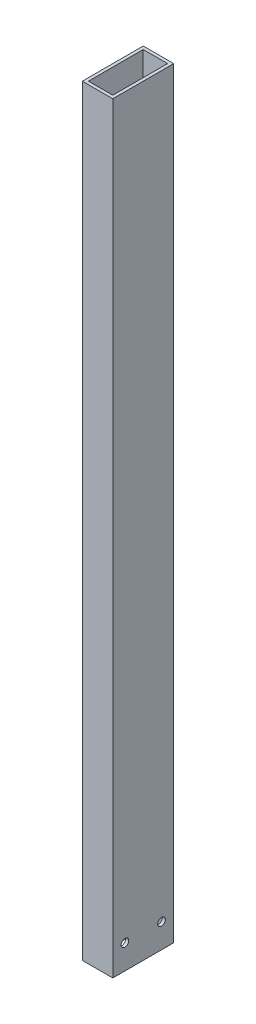
ISO-10303-21;
HEADER;
FILE_DESCRIPTION(('STEP AP214'),'2;1');
FILE_NAME('part.step','',(''),(''),'','','');
FILE_SCHEMA(('AUTOMOTIVE_DESIGN { 1 0 10303 214 1 1 1 1 }'));
ENDSEC;
DATA;
#1=APPLICATION_CONTEXT('core data for automotive mechanical design processes');
#2=APPLICATION_PROTOCOL_DEFINITION('international standard','automotive_design',2000,#1);
#3=PRODUCT_CONTEXT('',#1,'mechanical');
#4=PRODUCT('Part','Part','',(#3));
#5=PRODUCT_RELATED_PRODUCT_CATEGORY('part','',(#4));
#6=PRODUCT_DEFINITION_FORMATION('','',#4);
#7=PRODUCT_DEFINITION_CONTEXT('part definition',#1,'design');
#8=PRODUCT_DEFINITION('design','',#6,#7);
#9=PRODUCT_DEFINITION_SHAPE('','',#8);
#10=(LENGTH_UNIT() NAMED_UNIT(*) SI_UNIT(.MILLI.,.METRE.));
#11=(NAMED_UNIT(*) PLANE_ANGLE_UNIT() SI_UNIT($,.RADIAN.));
#12=(NAMED_UNIT(*) SI_UNIT($,.STERADIAN.) SOLID_ANGLE_UNIT());
#13=UNCERTAINTY_MEASURE_WITH_UNIT(LENGTH_MEASURE(1.E-05),#10,'distance_accuracy_value','');
#14=(GEOMETRIC_REPRESENTATION_CONTEXT(3) GLOBAL_UNCERTAINTY_ASSIGNED_CONTEXT((#13)) GLOBAL_UNIT_ASSIGNED_CONTEXT((#10,
#11,#12)) REPRESENTATION_CONTEXT('',''));
#15=CARTESIAN_POINT('',(0.,0.,0.));
#16=DIRECTION('',(0.,0.,1.));
#17=DIRECTION('',(1.,0.,0.));
#18=AXIS2_PLACEMENT_3D('',#15,#16,#17);
#19=CARTESIAN_POINT('',(10.,-500.,20.));
#20=DIRECTION('',(1.,0.,0.));
#21=DIRECTION('',(0.,0.,-1.));
#22=AXIS2_PLACEMENT_3D('',#19,#20,#21);
#23=PLANE('',#22);
#24=CARTESIAN_POINT('',(10.,-484.,12.));
#25=DIRECTION('',(1.,0.,0.));
#26=DIRECTION('',(0.,0.,-1.));
#27=AXIS2_PLACEMENT_3D('',#24,#25,#26);
#28=CIRCLE('',#27,2.5);
#29=CARTESIAN_POINT('',(10.,-484.,9.50000000000004));
#30=VERTEX_POINT('',#29);
#31=EDGE_CURVE('E204',#30,#30,#28,.T.);
#32=ORIENTED_EDGE('',*,*,#31,.F.);
#33=EDGE_LOOP('',(#32));
#34=FACE_BOUND('',#33,.T.);
#35=CARTESIAN_POINT('',(10.,-484.,-12.));
#36=DIRECTION('',(1.,0.,0.));
#37=DIRECTION('',(0.,0.,-1.));
#38=AXIS2_PLACEMENT_3D('',#35,#36,#37);
#39=CIRCLE('',#38,2.5);
#40=CARTESIAN_POINT('',(10.,-484.,-14.5));
#41=VERTEX_POINT('',#40);
#42=EDGE_CURVE('E207',#41,#41,#39,.T.);
#43=ORIENTED_EDGE('',*,*,#42,.F.);
#44=EDGE_LOOP('',(#43));
#45=FACE_BOUND('',#44,.T.);
#46=DIRECTION('',(0.,0.,-1.));
#47=VECTOR('',#46,1.);
#48=CARTESIAN_POINT('',(10.,0.,20.));
#49=LINE('',#48,#47);
#50=CARTESIAN_POINT('',(10.,0.,20.));
#51=VERTEX_POINT('',#50);
#52=CARTESIAN_POINT('',(10.,0.,-20.));
#53=VERTEX_POINT('',#52);
#54=EDGE_CURVE('E138',#51,#53,#49,.T.);
#55=ORIENTED_EDGE('',*,*,#54,.F.);
#56=DIRECTION('',(0.,1.,0.));
#57=VECTOR('',#56,1.);
#58=CARTESIAN_POINT('',(10.,-500.,20.));
#59=LINE('',#58,#57);
#60=CARTESIAN_POINT('',(10.,-500.,20.));
#61=VERTEX_POINT('',#60);
#62=EDGE_CURVE('E11',#61,#51,#59,.T.);
#63=ORIENTED_EDGE('',*,*,#62,.F.);
#64=DIRECTION('',(0.,0.,-1.));
#65=VECTOR('',#64,1.);
#66=CARTESIAN_POINT('',(10.,-500.,20.));
#67=LINE('',#66,#65);
#68=CARTESIAN_POINT('',(10.,-500.,-20.));
#69=VERTEX_POINT('',#68);
#70=EDGE_CURVE('E142',#61,#69,#67,.T.);
#71=ORIENTED_EDGE('',*,*,#70,.T.);
#72=DIRECTION('',(0.,1.,0.));
#73=VECTOR('',#72,1.);
#74=CARTESIAN_POINT('',(10.,-500.,-20.));
#75=LINE('',#74,#73);
#76=EDGE_CURVE('E155',#69,#53,#75,.T.);
#77=ORIENTED_EDGE('',*,*,#76,.T.);
#78=EDGE_LOOP('',(#55,#63,#71,#77));
#79=FACE_BOUND('',#78,.T.);
#80=ADVANCED_FACE('F37',(#34,#45,#79),#23,.T.);
#81=CARTESIAN_POINT('',(-9.99999999999999,-500.,20.));
#82=DIRECTION('',(0.,0.,1.));
#83=DIRECTION('',(1.,0.,0.));
#84=AXIS2_PLACEMENT_3D('',#81,#82,#83);
#85=PLANE('',#84);
#86=DIRECTION('',(1.,0.,0.));
#87=VECTOR('',#86,1.);
#88=CARTESIAN_POINT('',(-9.99999999999999,0.,20.));
#89=LINE('',#88,#87);
#90=CARTESIAN_POINT('',(-9.99999999999999,0.,20.));
#91=VERTEX_POINT('',#90);
#92=EDGE_CURVE('E146',#91,#51,#89,.T.);
#93=ORIENTED_EDGE('',*,*,#92,.F.);
#94=DIRECTION('',(0.,1.,0.));
#95=VECTOR('',#94,1.);
#96=CARTESIAN_POINT('',(-9.99999999999999,-500.,20.));
#97=LINE('',#96,#95);
#98=CARTESIAN_POINT('',(-9.99999999999999,-500.,20.));
#99=VERTEX_POINT('',#98);
#100=EDGE_CURVE('E45',#99,#91,#97,.T.);
#101=ORIENTED_EDGE('',*,*,#100,.F.);
#102=DIRECTION('',(1.,0.,0.));
#103=VECTOR('',#102,1.);
#104=CARTESIAN_POINT('',(-9.99999999999999,-500.,20.));
#105=LINE('',#104,#103);
#106=EDGE_CURVE('E152',#99,#61,#105,.T.);
#107=ORIENTED_EDGE('',*,*,#106,.T.);
#108=ORIENTED_EDGE('',*,*,#62,.T.);
#109=EDGE_LOOP('',(#93,#101,#107,#108));
#110=FACE_BOUND('',#109,.T.);
#111=ADVANCED_FACE('F180',(#110),#85,.T.);
#112=CARTESIAN_POINT('',(-9.99999999999999,-500.,20.));
#113=DIRECTION('',(-1.,0.,0.));
#114=DIRECTION('',(0.,0.,1.));
#115=AXIS2_PLACEMENT_3D('',#112,#113,#114);
#116=PLANE('',#115);
#117=CARTESIAN_POINT('',(-9.99999999999999,-484.,12.));
#118=DIRECTION('',(1.,0.,0.));
#119=DIRECTION('',(0.,0.,-1.));
#120=AXIS2_PLACEMENT_3D('',#117,#118,#119);
#121=CIRCLE('',#120,2.5);
#122=CARTESIAN_POINT('',(-9.99999999999999,-484.,9.50000000000004));
#123=VERTEX_POINT('',#122);
#124=EDGE_CURVE('E219',#123,#123,#121,.T.);
#125=ORIENTED_EDGE('',*,*,#124,.T.);
#126=EDGE_LOOP('',(#125));
#127=FACE_BOUND('',#126,.T.);
#128=CARTESIAN_POINT('',(-9.99999999999999,-484.,-12.));
#129=DIRECTION('',(1.,0.,0.));
#130=DIRECTION('',(0.,0.,-1.));
#131=AXIS2_PLACEMENT_3D('',#128,#129,#130);
#132=CIRCLE('',#131,2.5);
#133=CARTESIAN_POINT('',(-9.99999999999999,-484.,-14.5));
#134=VERTEX_POINT('',#133);
#135=EDGE_CURVE('E209',#134,#134,#132,.T.);
#136=ORIENTED_EDGE('',*,*,#135,.T.);
#137=EDGE_LOOP('',(#136));
#138=FACE_BOUND('',#137,.T.);
#139=DIRECTION('',(0.,0.,1.));
#140=VECTOR('',#139,1.);
#141=CARTESIAN_POINT('',(-9.99999999999999,0.,20.));
#142=LINE('',#141,#140);
#143=CARTESIAN_POINT('',(-9.99999999999999,0.,-20.));
#144=VERTEX_POINT('',#143);
#145=EDGE_CURVE('E161',#144,#91,#142,.T.);
#146=ORIENTED_EDGE('',*,*,#145,.F.);
#147=DIRECTION('',(0.,1.,0.));
#148=VECTOR('',#147,1.);
#149=CARTESIAN_POINT('',(-9.99999999999999,-500.,-20.));
#150=LINE('',#149,#148);
#151=CARTESIAN_POINT('',(-9.99999999999999,-500.,-20.));
#152=VERTEX_POINT('',#151);
#153=EDGE_CURVE('E167',#152,#144,#150,.T.);
#154=ORIENTED_EDGE('',*,*,#153,.F.);
#155=DIRECTION('',(0.,0.,1.));
#156=VECTOR('',#155,1.);
#157=CARTESIAN_POINT('',(-9.99999999999999,-500.,20.));
#158=LINE('',#157,#156);
#159=EDGE_CURVE('E149',#152,#99,#158,.T.);
#160=ORIENTED_EDGE('',*,*,#159,.T.);
#161=ORIENTED_EDGE('',*,*,#100,.T.);
#162=EDGE_LOOP('',(#146,#154,#160,#161));
#163=FACE_BOUND('',#162,.T.);
#164=ADVANCED_FACE('F184',(#127,#138,#163),#116,.T.);
#165=CARTESIAN_POINT('',(-9.99999999999999,-500.,-20.));
#166=DIRECTION('',(0.,0.,-1.));
#167=DIRECTION('',(-1.,0.,0.));
#168=AXIS2_PLACEMENT_3D('',#165,#166,#167);
#169=PLANE('',#168);
#170=DIRECTION('',(-1.,0.,0.));
#171=VECTOR('',#170,1.);
#172=CARTESIAN_POINT('',(-9.99999999999999,0.,-20.));
#173=LINE('',#172,#171);
#174=EDGE_CURVE('E158',#53,#144,#173,.T.);
#175=ORIENTED_EDGE('',*,*,#174,.F.);
#176=ORIENTED_EDGE('',*,*,#76,.F.);
#177=DIRECTION('',(-1.,0.,0.));
#178=VECTOR('',#177,1.);
#179=CARTESIAN_POINT('',(-9.99999999999999,-500.,-20.));
#180=LINE('',#179,#178);
#181=EDGE_CURVE('E145',#69,#152,#180,.T.);
#182=ORIENTED_EDGE('',*,*,#181,.T.);
#183=ORIENTED_EDGE('',*,*,#153,.T.);
#184=EDGE_LOOP('',(#175,#176,#182,#183));
#185=FACE_BOUND('',#184,.T.);
#186=ADVANCED_FACE('F174',(#185),#169,.T.);
#187=CARTESIAN_POINT('',(0.,-500.,0.));
#188=DIRECTION('',(0.,-1.,0.));
#189=DIRECTION('',(0.,0.,-1.));
#190=AXIS2_PLACEMENT_3D('',#187,#188,#189);
#191=PLANE('',#190);
#192=DIRECTION('',(0.,0.,-1.));
#193=VECTOR('',#192,1.);
#194=CARTESIAN_POINT('',(8.00000000000001,-500.,18.));
#195=LINE('',#194,#193);
#196=CARTESIAN_POINT('',(8.00000000000001,-500.,18.));
#197=VERTEX_POINT('',#196);
#198=CARTESIAN_POINT('',(8.00000000000001,-500.,-18.));
#199=VERTEX_POINT('',#198);
#200=EDGE_CURVE('E104',#197,#199,#195,.T.);
#201=ORIENTED_EDGE('',*,*,#200,.T.);
#202=DIRECTION('',(-1.,0.,0.));
#203=VECTOR('',#202,1.);
#204=CARTESIAN_POINT('',(-7.99999999999998,-500.,-18.));
#205=LINE('',#204,#203);
#206=CARTESIAN_POINT('',(-7.99999999999998,-500.,-18.));
#207=VERTEX_POINT('',#206);
#208=EDGE_CURVE('E113',#199,#207,#205,.T.);
#209=ORIENTED_EDGE('',*,*,#208,.T.);
#210=DIRECTION('',(0.,0.,1.));
#211=VECTOR('',#210,1.);
#212=CARTESIAN_POINT('',(-7.99999999999998,-500.,18.));
#213=LINE('',#212,#211);
#214=CARTESIAN_POINT('',(-7.99999999999998,-500.,18.));
#215=VERTEX_POINT('',#214);
#216=EDGE_CURVE('E53',#207,#215,#213,.T.);
#217=ORIENTED_EDGE('',*,*,#216,.T.);
#218=DIRECTION('',(1.,0.,0.));
#219=VECTOR('',#218,1.);
#220=CARTESIAN_POINT('',(-7.99999999999998,-500.,18.));
#221=LINE('',#220,#219);
#222=EDGE_CURVE('E110',#215,#197,#221,.T.);
#223=ORIENTED_EDGE('',*,*,#222,.T.);
#224=EDGE_LOOP('',(#201,#209,#217,#223));
#225=FACE_BOUND('',#224,.T.);
#226=ORIENTED_EDGE('',*,*,#70,.F.);
#227=ORIENTED_EDGE('',*,*,#106,.F.);
#228=ORIENTED_EDGE('',*,*,#159,.F.);
#229=ORIENTED_EDGE('',*,*,#181,.F.);
#230=EDGE_LOOP('',(#226,#227,#228,#229));
#231=FACE_BOUND('',#230,.T.);
#232=ADVANCED_FACE('F117',(#225,#231),#191,.T.);
#233=CARTESIAN_POINT('',(0.,0.,0.));
#234=DIRECTION('',(0.,-1.,0.));
#235=DIRECTION('',(0.,0.,-1.));
#236=AXIS2_PLACEMENT_3D('',#233,#234,#235);
#237=PLANE('',#236);
#238=DIRECTION('',(-1.,0.,0.));
#239=VECTOR('',#238,1.);
#240=CARTESIAN_POINT('',(-7.99999999999998,0.,-18.));
#241=LINE('',#240,#239);
#242=CARTESIAN_POINT('',(8.00000000000001,0.,-18.));
#243=VERTEX_POINT('',#242);
#244=CARTESIAN_POINT('',(-7.99999999999998,0.,-18.));
#245=VERTEX_POINT('',#244);
#246=EDGE_CURVE('E132',#243,#245,#241,.T.);
#247=ORIENTED_EDGE('',*,*,#246,.F.);
#248=DIRECTION('',(0.,0.,-1.));
#249=VECTOR('',#248,1.);
#250=CARTESIAN_POINT('',(8.00000000000001,0.,18.));
#251=LINE('',#250,#249);
#252=CARTESIAN_POINT('',(8.00000000000001,0.,18.));
#253=VERTEX_POINT('',#252);
#254=EDGE_CURVE('E61',#253,#243,#251,.T.);
#255=ORIENTED_EDGE('',*,*,#254,.F.);
#256=DIRECTION('',(1.,0.,0.));
#257=VECTOR('',#256,1.);
#258=CARTESIAN_POINT('',(-7.99999999999998,0.,18.));
#259=LINE('',#258,#257);
#260=CARTESIAN_POINT('',(-7.99999999999998,0.,18.));
#261=VERTEX_POINT('',#260);
#262=EDGE_CURVE('E120',#261,#253,#259,.T.);
#263=ORIENTED_EDGE('',*,*,#262,.F.);
#264=DIRECTION('',(0.,0.,1.));
#265=VECTOR('',#264,1.);
#266=CARTESIAN_POINT('',(-7.99999999999998,0.,18.));
#267=LINE('',#266,#265);
#268=EDGE_CURVE('E123',#245,#261,#267,.T.);
#269=ORIENTED_EDGE('',*,*,#268,.F.);
#270=EDGE_LOOP('',(#247,#255,#263,#269));
#271=FACE_BOUND('',#270,.T.);
#272=ORIENTED_EDGE('',*,*,#54,.T.);
#273=ORIENTED_EDGE('',*,*,#174,.T.);
#274=ORIENTED_EDGE('',*,*,#145,.T.);
#275=ORIENTED_EDGE('',*,*,#92,.T.);
#276=EDGE_LOOP('',(#272,#273,#274,#275));
#277=FACE_BOUND('',#276,.T.);
#278=ADVANCED_FACE('F177',(#271,#277),#237,.F.);
#279=CARTESIAN_POINT('',(8.00000000000001,-500.,18.));
#280=DIRECTION('',(1.,0.,0.));
#281=DIRECTION('',(0.,0.,-1.));
#282=AXIS2_PLACEMENT_3D('',#279,#280,#281);
#283=PLANE('',#282);
#284=CARTESIAN_POINT('',(8.00000000000001,-484.,12.));
#285=DIRECTION('',(1.,0.,0.));
#286=DIRECTION('',(0.,0.,-1.));
#287=AXIS2_PLACEMENT_3D('',#284,#285,#286);
#288=CIRCLE('',#287,2.5);
#289=CARTESIAN_POINT('',(8.00000000000001,-484.,9.50000000000004));
#290=VERTEX_POINT('',#289);
#291=EDGE_CURVE('E210',#290,#290,#288,.T.);
#292=ORIENTED_EDGE('',*,*,#291,.T.);
#293=EDGE_LOOP('',(#292));
#294=FACE_BOUND('',#293,.T.);
#295=CARTESIAN_POINT('',(8.00000000000001,-484.,-12.));
#296=DIRECTION('',(1.,0.,0.));
#297=DIRECTION('',(0.,0.,-1.));
#298=AXIS2_PLACEMENT_3D('',#295,#296,#297);
#299=CIRCLE('',#298,2.5);
#300=CARTESIAN_POINT('',(8.00000000000001,-484.,-14.5));
#301=VERTEX_POINT('',#300);
#302=EDGE_CURVE('E126',#301,#301,#299,.T.);
#303=ORIENTED_EDGE('',*,*,#302,.T.);
#304=EDGE_LOOP('',(#303));
#305=FACE_BOUND('',#304,.T.);
#306=ORIENTED_EDGE('',*,*,#254,.T.);
#307=DIRECTION('',(0.,1.,0.));
#308=VECTOR('',#307,1.);
#309=CARTESIAN_POINT('',(8.00000000000001,-500.,-18.));
#310=LINE('',#309,#308);
#311=EDGE_CURVE('E100',#199,#243,#310,.T.);
#312=ORIENTED_EDGE('',*,*,#311,.F.);
#313=ORIENTED_EDGE('',*,*,#200,.F.);
#314=DIRECTION('',(0.,1.,0.));
#315=VECTOR('',#314,1.);
#316=CARTESIAN_POINT('',(8.00000000000001,-500.,18.));
#317=LINE('',#316,#315);
#318=EDGE_CURVE('E136',#197,#253,#317,.T.);
#319=ORIENTED_EDGE('',*,*,#318,.T.);
#320=EDGE_LOOP('',(#306,#312,#313,#319));
#321=FACE_BOUND('',#320,.T.);
#322=ADVANCED_FACE('F102',(#294,#305,#321),#283,.F.);
#323=CARTESIAN_POINT('',(-7.99999999999998,-500.,18.));
#324=DIRECTION('',(0.,0.,1.));
#325=DIRECTION('',(1.,0.,0.));
#326=AXIS2_PLACEMENT_3D('',#323,#324,#325);
#327=PLANE('',#326);
#328=ORIENTED_EDGE('',*,*,#262,.T.);
#329=ORIENTED_EDGE('',*,*,#318,.F.);
#330=ORIENTED_EDGE('',*,*,#222,.F.);
#331=DIRECTION('',(0.,1.,0.));
#332=VECTOR('',#331,1.);
#333=CARTESIAN_POINT('',(-7.99999999999998,-500.,18.));
#334=LINE('',#333,#332);
#335=EDGE_CURVE('E139',#215,#261,#334,.T.);
#336=ORIENTED_EDGE('',*,*,#335,.T.);
#337=EDGE_LOOP('',(#328,#329,#330,#336));
#338=FACE_BOUND('',#337,.T.);
#339=ADVANCED_FACE('F231',(#338),#327,.F.);
#340=CARTESIAN_POINT('',(-7.99999999999998,-500.,18.));
#341=DIRECTION('',(-1.,0.,0.));
#342=DIRECTION('',(0.,0.,1.));
#343=AXIS2_PLACEMENT_3D('',#340,#341,#342);
#344=PLANE('',#343);
#345=CARTESIAN_POINT('',(-7.99999999999998,-484.,12.));
#346=DIRECTION('',(-1.,0.,0.));
#347=DIRECTION('',(0.,0.,1.));
#348=AXIS2_PLACEMENT_3D('',#345,#346,#347);
#349=CIRCLE('',#348,2.5);
#350=CARTESIAN_POINT('',(-7.99999999999998,-484.,14.5));
#351=VERTEX_POINT('',#350);
#352=EDGE_CURVE('E214',#351,#351,#349,.T.);
#353=ORIENTED_EDGE('',*,*,#352,.T.);
#354=EDGE_LOOP('',(#353));
#355=FACE_BOUND('',#354,.T.);
#356=CARTESIAN_POINT('',(-7.99999999999998,-484.,-12.));
#357=DIRECTION('',(-1.,0.,0.));
#358=DIRECTION('',(0.,0.,1.));
#359=AXIS2_PLACEMENT_3D('',#356,#357,#358);
#360=CIRCLE('',#359,2.5);
#361=CARTESIAN_POINT('',(-7.99999999999998,-484.,-9.49999999999996));
#362=VERTEX_POINT('',#361);
#363=EDGE_CURVE('E40',#362,#362,#360,.T.);
#364=ORIENTED_EDGE('',*,*,#363,.T.);
#365=EDGE_LOOP('',(#364));
#366=FACE_BOUND('',#365,.T.);
#367=ORIENTED_EDGE('',*,*,#268,.T.);
#368=ORIENTED_EDGE('',*,*,#335,.F.);
#369=ORIENTED_EDGE('',*,*,#216,.F.);
#370=DIRECTION('',(0.,1.,0.));
#371=VECTOR('',#370,1.);
#372=CARTESIAN_POINT('',(-7.99999999999998,-500.,-18.));
#373=LINE('',#372,#371);
#374=EDGE_CURVE('E109',#207,#245,#373,.T.);
#375=ORIENTED_EDGE('',*,*,#374,.T.);
#376=EDGE_LOOP('',(#367,#368,#369,#375));
#377=FACE_BOUND('',#376,.T.);
#378=ADVANCED_FACE('F239',(#355,#366,#377),#344,.F.);
#379=CARTESIAN_POINT('',(-7.99999999999998,-500.,-18.));
#380=DIRECTION('',(0.,0.,-1.));
#381=DIRECTION('',(-1.,0.,0.));
#382=AXIS2_PLACEMENT_3D('',#379,#380,#381);
#383=PLANE('',#382);
#384=ORIENTED_EDGE('',*,*,#246,.T.);
#385=ORIENTED_EDGE('',*,*,#374,.F.);
#386=ORIENTED_EDGE('',*,*,#208,.F.);
#387=ORIENTED_EDGE('',*,*,#311,.T.);
#388=EDGE_LOOP('',(#384,#385,#386,#387));
#389=FACE_BOUND('',#388,.T.);
#390=ADVANCED_FACE('F114',(#389),#383,.F.);
#391=CARTESIAN_POINT('',(10.,-484.,-12.));
#392=DIRECTION('',(1.,0.,0.));
#393=DIRECTION('',(0.,0.,-1.));
#394=AXIS2_PLACEMENT_3D('',#391,#392,#393);
#395=CYLINDRICAL_SURFACE('',#394,2.5);
#396=ORIENTED_EDGE('',*,*,#135,.F.);
#397=EDGE_LOOP('',(#396));
#398=FACE_BOUND('',#397,.T.);
#399=ORIENTED_EDGE('',*,*,#363,.F.);
#400=EDGE_LOOP('',(#399));
#401=FACE_BOUND('',#400,.T.);
#402=ADVANCED_FACE('F241',(#398,#401),#395,.F.);
#403=ORIENTED_EDGE('',*,*,#42,.T.);
#404=EDGE_LOOP('',(#403));
#405=FACE_BOUND('',#404,.T.);
#406=ORIENTED_EDGE('',*,*,#302,.F.);
#407=EDGE_LOOP('',(#406));
#408=FACE_BOUND('',#407,.T.);
#409=ADVANCED_FACE('F226',(#405,#408),#395,.F.);
#410=CARTESIAN_POINT('',(10.,-484.,12.));
#411=DIRECTION('',(1.,0.,0.));
#412=DIRECTION('',(0.,0.,-1.));
#413=AXIS2_PLACEMENT_3D('',#410,#411,#412);
#414=CYLINDRICAL_SURFACE('',#413,2.5);
#415=ORIENTED_EDGE('',*,*,#31,.T.);
#416=EDGE_LOOP('',(#415));
#417=FACE_BOUND('',#416,.T.);
#418=ORIENTED_EDGE('',*,*,#291,.F.);
#419=EDGE_LOOP('',(#418));
#420=FACE_BOUND('',#419,.T.);
#421=ADVANCED_FACE('F222',(#417,#420),#414,.F.);
#422=ORIENTED_EDGE('',*,*,#124,.F.);
#423=EDGE_LOOP('',(#422));
#424=FACE_BOUND('',#423,.T.);
#425=ORIENTED_EDGE('',*,*,#352,.F.);
#426=EDGE_LOOP('',(#425));
#427=FACE_BOUND('',#426,.T.);
#428=ADVANCED_FACE('F225',(#424,#427),#414,.F.);
#429=CLOSED_SHELL('',(#80,#111,#164,#186,#232,#278,#322,#339,#378,#390,#402,#409,#421,#428));
#430=MANIFOLD_SOLID_BREP('B2',#429);
#431=ADVANCED_BREP_SHAPE_REPRESENTATION('',(#18,#430),#14);
#432=SHAPE_DEFINITION_REPRESENTATION(#9,#431);
ENDSEC;
END-ISO-10303-21;
